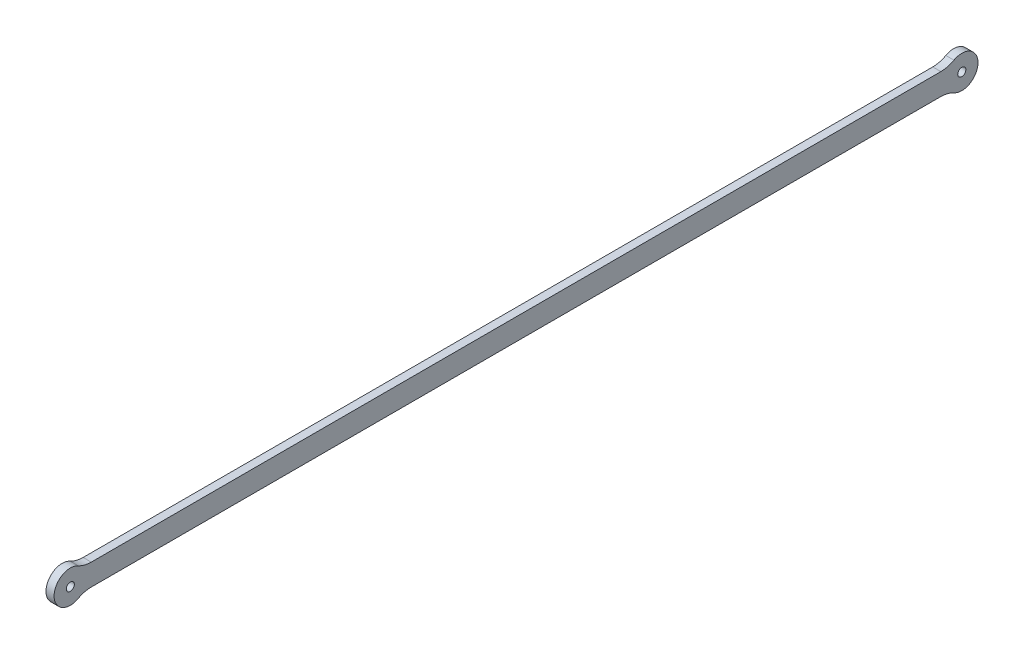
ISO-10303-21;
HEADER;
FILE_DESCRIPTION(('STEP AP214'),'2;1');
FILE_NAME('part.step','',(''),(''),'','','');
FILE_SCHEMA(('AUTOMOTIVE_DESIGN { 1 0 10303 214 1 1 1 1 }'));
ENDSEC;
DATA;
#1=APPLICATION_CONTEXT('core data for automotive mechanical design processes');
#2=APPLICATION_PROTOCOL_DEFINITION('international standard','automotive_design',2000,#1);
#3=PRODUCT_CONTEXT('',#1,'mechanical');
#4=PRODUCT('Part','Part','',(#3));
#5=PRODUCT_RELATED_PRODUCT_CATEGORY('part','',(#4));
#6=PRODUCT_DEFINITION_FORMATION('','',#4);
#7=PRODUCT_DEFINITION_CONTEXT('part definition',#1,'design');
#8=PRODUCT_DEFINITION('design','',#6,#7);
#9=PRODUCT_DEFINITION_SHAPE('','',#8);
#10=(LENGTH_UNIT() NAMED_UNIT(*) SI_UNIT(.MILLI.,.METRE.));
#11=(NAMED_UNIT(*) PLANE_ANGLE_UNIT() SI_UNIT($,.RADIAN.));
#12=(NAMED_UNIT(*) SI_UNIT($,.STERADIAN.) SOLID_ANGLE_UNIT());
#13=UNCERTAINTY_MEASURE_WITH_UNIT(LENGTH_MEASURE(1.E-05),#10,'distance_accuracy_value','');
#14=(GEOMETRIC_REPRESENTATION_CONTEXT(3) GLOBAL_UNCERTAINTY_ASSIGNED_CONTEXT((#13)) GLOBAL_UNIT_ASSIGNED_CONTEXT((#10,
#11,#12)) REPRESENTATION_CONTEXT('',''));
#15=CARTESIAN_POINT('',(0.,0.,0.));
#16=DIRECTION('',(0.,0.,1.));
#17=DIRECTION('',(1.,0.,0.));
#18=AXIS2_PLACEMENT_3D('',#15,#16,#17);
#19=CARTESIAN_POINT('',(3.,14.,-157.254033307585));
#20=DIRECTION('',(-1.,0.,0.));
#21=DIRECTION('',(0.,0.,1.));
#22=AXIS2_PLACEMENT_3D('',#19,#20,#21);
#23=CYLINDRICAL_SURFACE('',#22,10.);
#24=DIRECTION('',(-1.,0.,0.));
#25=VECTOR('',#24,1.);
#26=CARTESIAN_POINT('',(3.,5.25000000000002,-162.095262490344));
#27=LINE('',#26,#25);
#28=CARTESIAN_POINT('',(0.,5.25000000000002,-162.095262490344));
#29=VERTEX_POINT('',#28);
#30=CARTESIAN_POINT('',(3.,5.25000000000002,-162.095262490344));
#31=VERTEX_POINT('',#30);
#32=EDGE_CURVE('E152',#29,#31,#27,.F.);
#33=ORIENTED_EDGE('',*,*,#32,.F.);
#34=CARTESIAN_POINT('',(0.,14.,-157.254033307585));
#35=DIRECTION('',(1.,0.,0.));
#36=DIRECTION('',(0.,0.,-1.));
#37=AXIS2_PLACEMENT_3D('',#34,#35,#36);
#38=CIRCLE('',#37,10.);
#39=CARTESIAN_POINT('',(0.,4.00000000000002,-157.254033307585));
#40=VERTEX_POINT('',#39);
#41=EDGE_CURVE('E41',#29,#40,#38,.F.);
#42=ORIENTED_EDGE('',*,*,#41,.T.);
#43=DIRECTION('',(-1.,0.,0.));
#44=VECTOR('',#43,1.);
#45=CARTESIAN_POINT('',(3.,4.00000000000002,-157.254033307585));
#46=LINE('',#45,#44);
#47=CARTESIAN_POINT('',(3.,4.00000000000002,-157.254033307585));
#48=VERTEX_POINT('',#47);
#49=EDGE_CURVE('E155',#48,#40,#46,.T.);
#50=ORIENTED_EDGE('',*,*,#49,.F.);
#51=CARTESIAN_POINT('',(3.,14.,-157.254033307585));
#52=DIRECTION('',(1.,0.,0.));
#53=DIRECTION('',(0.,0.,-1.));
#54=AXIS2_PLACEMENT_3D('',#51,#52,#53);
#55=CIRCLE('',#54,10.);
#56=EDGE_CURVE('E11',#48,#31,#55,.T.);
#57=ORIENTED_EDGE('',*,*,#56,.T.);
#58=EDGE_LOOP('',(#33,#42,#50,#57));
#59=FACE_BOUND('',#58,.T.);
#60=ADVANCED_FACE('F34',(#59),#23,.F.);
#61=CARTESIAN_POINT('',(3.,-14.,-157.254033307585));
#62=DIRECTION('',(-1.,0.,0.));
#63=DIRECTION('',(0.,0.,1.));
#64=AXIS2_PLACEMENT_3D('',#61,#62,#63);
#65=CYLINDRICAL_SURFACE('',#64,10.);
#66=DIRECTION('',(-1.,0.,0.));
#67=VECTOR('',#66,1.);
#68=CARTESIAN_POINT('',(3.,-5.25000000000001,-162.095262490344));
#69=LINE('',#68,#67);
#70=CARTESIAN_POINT('',(3.,-5.25000000000001,-162.095262490344));
#71=VERTEX_POINT('',#70);
#72=CARTESIAN_POINT('',(0.,-5.25000000000001,-162.095262490344));
#73=VERTEX_POINT('',#72);
#74=EDGE_CURVE('E142',#71,#73,#69,.T.);
#75=ORIENTED_EDGE('',*,*,#74,.F.);
#76=CARTESIAN_POINT('',(3.,-14.,-157.254033307585));
#77=DIRECTION('',(1.,0.,0.));
#78=DIRECTION('',(0.,0.,-1.));
#79=AXIS2_PLACEMENT_3D('',#76,#77,#78);
#80=CIRCLE('',#79,10.);
#81=CARTESIAN_POINT('',(3.,-3.99999999999999,-157.254033307585));
#82=VERTEX_POINT('',#81);
#83=EDGE_CURVE('E148',#71,#82,#80,.T.);
#84=ORIENTED_EDGE('',*,*,#83,.T.);
#85=DIRECTION('',(-1.,0.,0.));
#86=VECTOR('',#85,1.);
#87=CARTESIAN_POINT('',(3.,-3.99999999999999,-157.254033307585));
#88=LINE('',#87,#86);
#89=CARTESIAN_POINT('',(0.,-3.99999999999999,-157.254033307585));
#90=VERTEX_POINT('',#89);
#91=EDGE_CURVE('E145',#90,#82,#88,.F.);
#92=ORIENTED_EDGE('',*,*,#91,.F.);
#93=CARTESIAN_POINT('',(0.,-14.,-157.254033307585));
#94=DIRECTION('',(1.,0.,0.));
#95=DIRECTION('',(0.,0.,-1.));
#96=AXIS2_PLACEMENT_3D('',#93,#94,#95);
#97=CIRCLE('',#96,10.);
#98=EDGE_CURVE('E150',#90,#73,#97,.F.);
#99=ORIENTED_EDGE('',*,*,#98,.T.);
#100=EDGE_LOOP('',(#75,#84,#92,#99));
#101=FACE_BOUND('',#100,.T.);
#102=ADVANCED_FACE('F198',(#101),#65,.F.);
#103=CARTESIAN_POINT('',(3.,-14.,157.254033307585));
#104=DIRECTION('',(-1.,0.,0.));
#105=DIRECTION('',(0.,0.,1.));
#106=AXIS2_PLACEMENT_3D('',#103,#104,#105);
#107=CYLINDRICAL_SURFACE('',#106,10.);
#108=DIRECTION('',(-1.,0.,0.));
#109=VECTOR('',#108,1.);
#110=CARTESIAN_POINT('',(3.,-5.25000000000002,162.095262490344));
#111=LINE('',#110,#109);
#112=CARTESIAN_POINT('',(0.,-5.25000000000002,162.095262490344));
#113=VERTEX_POINT('',#112);
#114=CARTESIAN_POINT('',(3.,-5.25000000000002,162.095262490344));
#115=VERTEX_POINT('',#114);
#116=EDGE_CURVE('E117',#113,#115,#111,.F.);
#117=ORIENTED_EDGE('',*,*,#116,.F.);
#118=CARTESIAN_POINT('',(0.,-14.,157.254033307585));
#119=DIRECTION('',(1.,0.,0.));
#120=DIRECTION('',(0.,0.,-1.));
#121=AXIS2_PLACEMENT_3D('',#118,#119,#120);
#122=CIRCLE('',#121,10.);
#123=CARTESIAN_POINT('',(0.,-4.00000000000004,157.254033307585));
#124=VERTEX_POINT('',#123);
#125=EDGE_CURVE('E103',#113,#124,#122,.F.);
#126=ORIENTED_EDGE('',*,*,#125,.T.);
#127=DIRECTION('',(-1.,0.,0.));
#128=VECTOR('',#127,1.);
#129=CARTESIAN_POINT('',(3.,-4.00000000000004,157.254033307585));
#130=LINE('',#129,#128);
#131=CARTESIAN_POINT('',(3.,-4.00000000000004,157.254033307585));
#132=VERTEX_POINT('',#131);
#133=EDGE_CURVE('E136',#132,#124,#130,.T.);
#134=ORIENTED_EDGE('',*,*,#133,.F.);
#135=CARTESIAN_POINT('',(3.,-14.,157.254033307585));
#136=DIRECTION('',(1.,0.,0.));
#137=DIRECTION('',(0.,0.,-1.));
#138=AXIS2_PLACEMENT_3D('',#135,#136,#137);
#139=CIRCLE('',#138,10.);
#140=EDGE_CURVE('E140',#132,#115,#139,.T.);
#141=ORIENTED_EDGE('',*,*,#140,.T.);
#142=EDGE_LOOP('',(#117,#126,#134,#141));
#143=FACE_BOUND('',#142,.T.);
#144=ADVANCED_FACE('F202',(#143),#107,.F.);
#145=CARTESIAN_POINT('',(3.,14.,157.254033307585));
#146=DIRECTION('',(-1.,0.,0.));
#147=DIRECTION('',(0.,0.,1.));
#148=AXIS2_PLACEMENT_3D('',#145,#146,#147);
#149=CYLINDRICAL_SURFACE('',#148,10.);
#150=DIRECTION('',(-1.,0.,0.));
#151=VECTOR('',#150,1.);
#152=CARTESIAN_POINT('',(3.,5.25,162.095262490344));
#153=LINE('',#152,#151);
#154=CARTESIAN_POINT('',(3.,5.25,162.095262490344));
#155=VERTEX_POINT('',#154);
#156=CARTESIAN_POINT('',(0.,5.25,162.095262490344));
#157=VERTEX_POINT('',#156);
#158=EDGE_CURVE('E113',#155,#157,#153,.T.);
#159=ORIENTED_EDGE('',*,*,#158,.F.);
#160=CARTESIAN_POINT('',(3.,14.,157.254033307585));
#161=DIRECTION('',(1.,0.,0.));
#162=DIRECTION('',(0.,0.,-1.));
#163=AXIS2_PLACEMENT_3D('',#160,#161,#162);
#164=CIRCLE('',#163,10.);
#165=CARTESIAN_POINT('',(3.,3.99999999999998,157.254033307585));
#166=VERTEX_POINT('',#165);
#167=EDGE_CURVE('E118',#155,#166,#164,.T.);
#168=ORIENTED_EDGE('',*,*,#167,.T.);
#169=DIRECTION('',(-1.,0.,0.));
#170=VECTOR('',#169,1.);
#171=CARTESIAN_POINT('',(3.,3.99999999999998,157.254033307585));
#172=LINE('',#171,#170);
#173=CARTESIAN_POINT('',(0.,3.99999999999998,157.254033307585));
#174=VERTEX_POINT('',#173);
#175=EDGE_CURVE('E115',#174,#166,#172,.F.);
#176=ORIENTED_EDGE('',*,*,#175,.F.);
#177=CARTESIAN_POINT('',(0.,14.,157.254033307585));
#178=DIRECTION('',(1.,0.,0.));
#179=DIRECTION('',(0.,0.,-1.));
#180=AXIS2_PLACEMENT_3D('',#177,#178,#179);
#181=CIRCLE('',#180,10.);
#182=EDGE_CURVE('E100',#174,#157,#181,.F.);
#183=ORIENTED_EDGE('',*,*,#182,.T.);
#184=EDGE_LOOP('',(#159,#168,#176,#183));
#185=FACE_BOUND('',#184,.T.);
#186=ADVANCED_FACE('F112',(#185),#149,.F.);
#187=CARTESIAN_POINT('',(3.,0.,-165.));
#188=DIRECTION('',(-1.,0.,0.));
#189=DIRECTION('',(0.,0.,1.));
#190=AXIS2_PLACEMENT_3D('',#187,#188,#189);
#191=CYLINDRICAL_SURFACE('',#190,6.00000000000002);
#192=CARTESIAN_POINT('',(0.,0.,-165.));
#193=DIRECTION('',(1.,0.,0.));
#194=DIRECTION('',(0.,0.,-1.));
#195=AXIS2_PLACEMENT_3D('',#192,#193,#194);
#196=CIRCLE('',#195,6.00000000000002);
#197=EDGE_CURVE('E163',#73,#29,#196,.T.);
#198=ORIENTED_EDGE('',*,*,#197,.T.);
#199=ORIENTED_EDGE('',*,*,#32,.T.);
#200=CARTESIAN_POINT('',(3.,0.,-165.));
#201=DIRECTION('',(1.,0.,0.));
#202=DIRECTION('',(0.,0.,-1.));
#203=AXIS2_PLACEMENT_3D('',#200,#201,#202);
#204=CIRCLE('',#203,6.00000000000002);
#205=EDGE_CURVE('E171',#71,#31,#204,.T.);
#206=ORIENTED_EDGE('',*,*,#205,.F.);
#207=ORIENTED_EDGE('',*,*,#74,.T.);
#208=EDGE_LOOP('',(#198,#199,#206,#207));
#209=FACE_BOUND('',#208,.T.);
#210=ADVANCED_FACE('F206',(#209),#191,.T.);
#211=CARTESIAN_POINT('',(3.,4.,0.));
#212=DIRECTION('',(0.,1.,0.));
#213=DIRECTION('',(0.,0.,1.));
#214=AXIS2_PLACEMENT_3D('',#211,#212,#213);
#215=PLANE('',#214);
#216=DIRECTION('',(0.,0.,-1.));
#217=VECTOR('',#216,1.);
#218=CARTESIAN_POINT('',(3.,4.,0.));
#219=LINE('',#218,#217);
#220=EDGE_CURVE('E160',#166,#48,#219,.T.);
#221=ORIENTED_EDGE('',*,*,#220,.T.);
#222=ORIENTED_EDGE('',*,*,#49,.T.);
#223=DIRECTION('',(0.,0.,-1.));
#224=VECTOR('',#223,1.);
#225=CARTESIAN_POINT('',(0.,4.,0.));
#226=LINE('',#225,#224);
#227=EDGE_CURVE('E159',#174,#40,#226,.T.);
#228=ORIENTED_EDGE('',*,*,#227,.F.);
#229=ORIENTED_EDGE('',*,*,#175,.T.);
#230=EDGE_LOOP('',(#221,#222,#228,#229));
#231=FACE_BOUND('',#230,.T.);
#232=ADVANCED_FACE('F158',(#231),#215,.T.);
#233=CARTESIAN_POINT('',(3.,-4.00000000000002,0.));
#234=DIRECTION('',(0.,-1.,0.));
#235=DIRECTION('',(0.,0.,-1.));
#236=AXIS2_PLACEMENT_3D('',#233,#234,#235);
#237=PLANE('',#236);
#238=DIRECTION('',(0.,0.,1.));
#239=VECTOR('',#238,1.);
#240=CARTESIAN_POINT('',(0.,-4.00000000000002,0.));
#241=LINE('',#240,#239);
#242=EDGE_CURVE('E162',#90,#124,#241,.T.);
#243=ORIENTED_EDGE('',*,*,#242,.F.);
#244=ORIENTED_EDGE('',*,*,#91,.T.);
#245=DIRECTION('',(0.,0.,1.));
#246=VECTOR('',#245,1.);
#247=CARTESIAN_POINT('',(3.,-4.00000000000002,0.));
#248=LINE('',#247,#246);
#249=EDGE_CURVE('E128',#82,#132,#248,.T.);
#250=ORIENTED_EDGE('',*,*,#249,.T.);
#251=ORIENTED_EDGE('',*,*,#133,.T.);
#252=EDGE_LOOP('',(#243,#244,#250,#251));
#253=FACE_BOUND('',#252,.T.);
#254=ADVANCED_FACE('F212',(#253),#237,.T.);
#255=CARTESIAN_POINT('',(3.,0.,-165.));
#256=DIRECTION('',(-1.,0.,0.));
#257=DIRECTION('',(0.,0.,1.));
#258=AXIS2_PLACEMENT_3D('',#255,#256,#257);
#259=CYLINDRICAL_SURFACE('',#258,1.5);
#260=CARTESIAN_POINT('',(3.,0.,-165.));
#261=DIRECTION('',(1.,0.,0.));
#262=DIRECTION('',(0.,0.,-1.));
#263=AXIS2_PLACEMENT_3D('',#260,#261,#262);
#264=CIRCLE('',#263,1.5);
#265=CARTESIAN_POINT('',(3.,0.,-166.5));
#266=VERTEX_POINT('',#265);
#267=EDGE_CURVE('E124',#266,#266,#264,.T.);
#268=ORIENTED_EDGE('',*,*,#267,.T.);
#269=EDGE_LOOP('',(#268));
#270=FACE_BOUND('',#269,.T.);
#271=CARTESIAN_POINT('',(0.,0.,-165.));
#272=DIRECTION('',(1.,0.,0.));
#273=DIRECTION('',(0.,0.,-1.));
#274=AXIS2_PLACEMENT_3D('',#271,#272,#273);
#275=CIRCLE('',#274,1.5);
#276=CARTESIAN_POINT('',(0.,0.,-166.5));
#277=VERTEX_POINT('',#276);
#278=EDGE_CURVE('E131',#277,#277,#275,.T.);
#279=ORIENTED_EDGE('',*,*,#278,.F.);
#280=EDGE_LOOP('',(#279));
#281=FACE_BOUND('',#280,.T.);
#282=ADVANCED_FACE('F194',(#270,#281),#259,.F.);
#283=CARTESIAN_POINT('',(3.,0.,0.));
#284=DIRECTION('',(1.,0.,0.));
#285=DIRECTION('',(0.,0.,-1.));
#286=AXIS2_PLACEMENT_3D('',#283,#284,#285);
#287=PLANE('',#286);
#288=ORIENTED_EDGE('',*,*,#83,.F.);
#289=ORIENTED_EDGE('',*,*,#205,.T.);
#290=ORIENTED_EDGE('',*,*,#56,.F.);
#291=ORIENTED_EDGE('',*,*,#220,.F.);
#292=ORIENTED_EDGE('',*,*,#167,.F.);
#293=CARTESIAN_POINT('',(3.,0.,165.));
#294=DIRECTION('',(-1.,0.,0.));
#295=DIRECTION('',(0.,0.,1.));
#296=AXIS2_PLACEMENT_3D('',#293,#294,#295);
#297=CIRCLE('',#296,6.00000000000002);
#298=EDGE_CURVE('E122',#115,#155,#297,.T.);
#299=ORIENTED_EDGE('',*,*,#298,.F.);
#300=ORIENTED_EDGE('',*,*,#140,.F.);
#301=ORIENTED_EDGE('',*,*,#249,.F.);
#302=EDGE_LOOP('',(#288,#289,#290,#291,#292,#299,#300,#301));
#303=FACE_BOUND('',#302,.T.);
#304=ORIENTED_EDGE('',*,*,#267,.F.);
#305=EDGE_LOOP('',(#304));
#306=FACE_BOUND('',#305,.T.);
#307=CARTESIAN_POINT('',(3.,0.,165.));
#308=DIRECTION('',(-1.,0.,0.));
#309=DIRECTION('',(0.,0.,1.));
#310=AXIS2_PLACEMENT_3D('',#307,#308,#309);
#311=CIRCLE('',#310,1.5);
#312=CARTESIAN_POINT('',(3.,0.,166.5));
#313=VERTEX_POINT('',#312);
#314=EDGE_CURVE('E166',#313,#313,#311,.T.);
#315=ORIENTED_EDGE('',*,*,#314,.T.);
#316=EDGE_LOOP('',(#315));
#317=FACE_BOUND('',#316,.T.);
#318=ADVANCED_FACE('F179',(#303,#306,#317),#287,.T.);
#319=CARTESIAN_POINT('',(0.,0.,0.));
#320=DIRECTION('',(1.,0.,0.));
#321=DIRECTION('',(0.,0.,-1.));
#322=AXIS2_PLACEMENT_3D('',#319,#320,#321);
#323=PLANE('',#322);
#324=ORIENTED_EDGE('',*,*,#98,.F.);
#325=ORIENTED_EDGE('',*,*,#242,.T.);
#326=ORIENTED_EDGE('',*,*,#125,.F.);
#327=CARTESIAN_POINT('',(0.,0.,165.));
#328=DIRECTION('',(-1.,0.,0.));
#329=DIRECTION('',(0.,0.,1.));
#330=AXIS2_PLACEMENT_3D('',#327,#328,#329);
#331=CIRCLE('',#330,6.00000000000002);
#332=EDGE_CURVE('E95',#113,#157,#331,.T.);
#333=ORIENTED_EDGE('',*,*,#332,.T.);
#334=ORIENTED_EDGE('',*,*,#182,.F.);
#335=ORIENTED_EDGE('',*,*,#227,.T.);
#336=ORIENTED_EDGE('',*,*,#41,.F.);
#337=ORIENTED_EDGE('',*,*,#197,.F.);
#338=EDGE_LOOP('',(#324,#325,#326,#333,#334,#335,#336,#337));
#339=FACE_BOUND('',#338,.T.);
#340=ORIENTED_EDGE('',*,*,#278,.T.);
#341=EDGE_LOOP('',(#340));
#342=FACE_BOUND('',#341,.T.);
#343=CARTESIAN_POINT('',(0.,0.,165.));
#344=DIRECTION('',(-1.,0.,0.));
#345=DIRECTION('',(0.,0.,1.));
#346=AXIS2_PLACEMENT_3D('',#343,#344,#345);
#347=CIRCLE('',#346,1.5);
#348=CARTESIAN_POINT('',(0.,0.,166.5));
#349=VERTEX_POINT('',#348);
#350=EDGE_CURVE('E108',#349,#349,#347,.T.);
#351=ORIENTED_EDGE('',*,*,#350,.F.);
#352=EDGE_LOOP('',(#351));
#353=FACE_BOUND('',#352,.T.);
#354=ADVANCED_FACE('F97',(#339,#342,#353),#323,.F.);
#355=CARTESIAN_POINT('',(3.,0.,165.));
#356=DIRECTION('',(-1.,0.,0.));
#357=DIRECTION('',(0.,0.,-1.));
#358=AXIS2_PLACEMENT_3D('',#355,#356,#357);
#359=CYLINDRICAL_SURFACE('',#358,6.00000000000002);
#360=ORIENTED_EDGE('',*,*,#332,.F.);
#361=ORIENTED_EDGE('',*,*,#116,.T.);
#362=ORIENTED_EDGE('',*,*,#298,.T.);
#363=ORIENTED_EDGE('',*,*,#158,.T.);
#364=EDGE_LOOP('',(#360,#361,#362,#363));
#365=FACE_BOUND('',#364,.T.);
#366=ADVANCED_FACE('F120',(#365),#359,.T.);
#367=CARTESIAN_POINT('',(3.,0.,165.));
#368=DIRECTION('',(-1.,0.,0.));
#369=DIRECTION('',(0.,0.,-1.));
#370=AXIS2_PLACEMENT_3D('',#367,#368,#369);
#371=CYLINDRICAL_SURFACE('',#370,1.5);
#372=ORIENTED_EDGE('',*,*,#314,.F.);
#373=EDGE_LOOP('',(#372));
#374=FACE_BOUND('',#373,.T.);
#375=ORIENTED_EDGE('',*,*,#350,.T.);
#376=EDGE_LOOP('',(#375));
#377=FACE_BOUND('',#376,.T.);
#378=ADVANCED_FACE('F181',(#374,#377),#371,.F.);
#379=CLOSED_SHELL('',(#60,#102,#144,#186,#210,#232,#254,#282,#318,#354,#366,#378));
#380=MANIFOLD_SOLID_BREP('B2',#379);
#381=ADVANCED_BREP_SHAPE_REPRESENTATION('',(#18,#380),#14);
#382=SHAPE_DEFINITION_REPRESENTATION(#9,#381);
ENDSEC;
END-ISO-10303-21;
